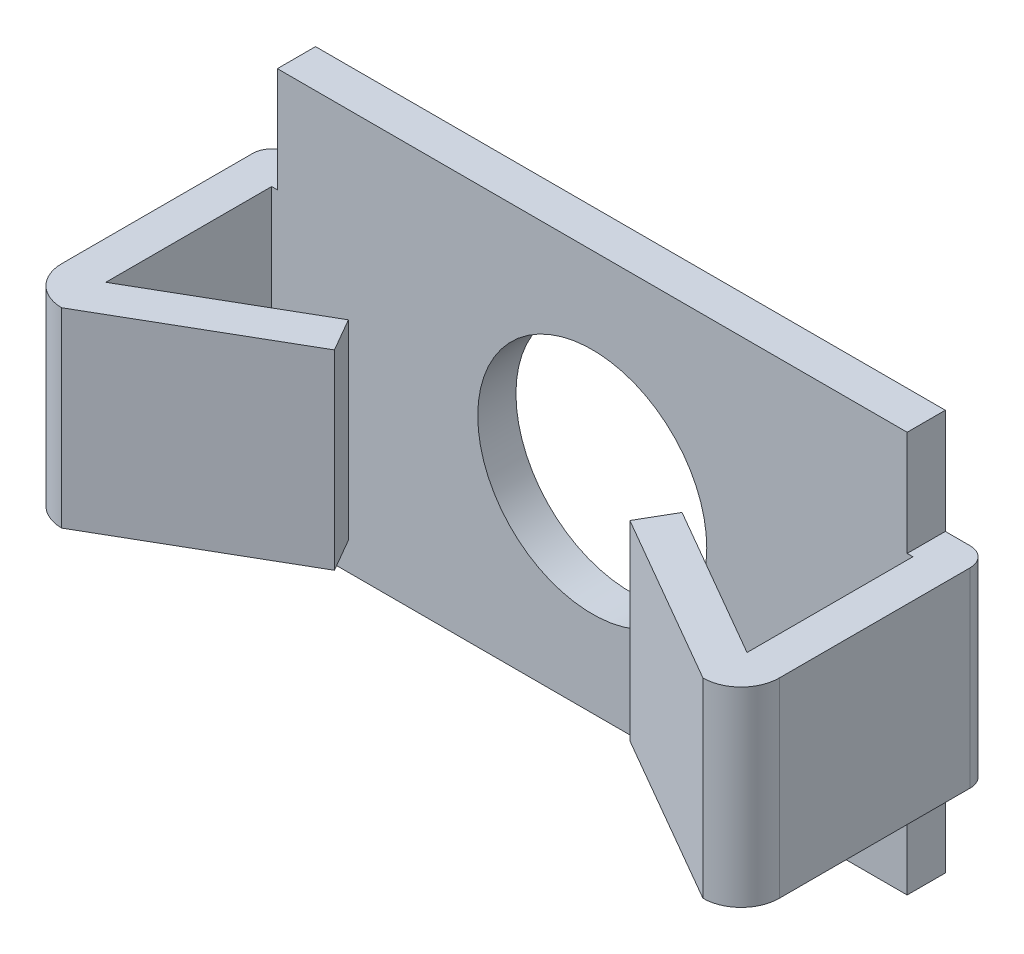
ISO-10303-21;
HEADER;
FILE_DESCRIPTION(('STEP AP214'),'2;1');
FILE_NAME('part.step','',(''),(''),'','','');
FILE_SCHEMA(('AUTOMOTIVE_DESIGN { 1 0 10303 214 1 1 1 1 }'));
ENDSEC;
DATA;
#1=APPLICATION_CONTEXT('core data for automotive mechanical design processes');
#2=APPLICATION_PROTOCOL_DEFINITION('international standard','automotive_design',2000,#1);
#3=PRODUCT_CONTEXT('',#1,'mechanical');
#4=PRODUCT('Part','Part','',(#3));
#5=PRODUCT_RELATED_PRODUCT_CATEGORY('part','',(#4));
#6=PRODUCT_DEFINITION_FORMATION('','',#4);
#7=PRODUCT_DEFINITION_CONTEXT('part definition',#1,'design');
#8=PRODUCT_DEFINITION('design','',#6,#7);
#9=PRODUCT_DEFINITION_SHAPE('','',#8);
#10=(LENGTH_UNIT() NAMED_UNIT(*) SI_UNIT(.MILLI.,.METRE.));
#11=(NAMED_UNIT(*) PLANE_ANGLE_UNIT() SI_UNIT($,.RADIAN.));
#12=(NAMED_UNIT(*) SI_UNIT($,.STERADIAN.) SOLID_ANGLE_UNIT());
#13=UNCERTAINTY_MEASURE_WITH_UNIT(LENGTH_MEASURE(1.E-05),#10,'distance_accuracy_value','');
#14=(GEOMETRIC_REPRESENTATION_CONTEXT(3) GLOBAL_UNCERTAINTY_ASSIGNED_CONTEXT((#13)) GLOBAL_UNIT_ASSIGNED_CONTEXT((#10,
#11,#12)) REPRESENTATION_CONTEXT('',''));
#15=CARTESIAN_POINT('',(0.,0.,0.));
#16=DIRECTION('',(0.,0.,1.));
#17=DIRECTION('',(1.,0.,0.));
#18=AXIS2_PLACEMENT_3D('',#15,#16,#17);
#19=CARTESIAN_POINT('',(16.8,5.,0.));
#20=DIRECTION('',(-1.,0.,0.));
#21=DIRECTION('',(0.,0.,-1.));
#22=AXIS2_PLACEMENT_3D('',#19,#20,#21);
#23=PLANE('',#22);
#24=DIRECTION('',(0.,0.,1.));
#25=VECTOR('',#24,1.);
#26=CARTESIAN_POINT('',(16.8,-5.,13.));
#27=LINE('',#26,#25);
#28=CARTESIAN_POINT('',(16.8,-5.,2.));
#29=VERTEX_POINT('',#28);
#30=CARTESIAN_POINT('',(16.8,-5.,10.6905989232415));
#31=VERTEX_POINT('',#30);
#32=EDGE_CURVE('E233',#29,#31,#27,.T.);
#33=ORIENTED_EDGE('',*,*,#32,.T.);
#34=DIRECTION('',(0.,1.,0.));
#35=VECTOR('',#34,1.);
#36=CARTESIAN_POINT('',(16.8,-16.4260197932816,10.6905989232415));
#37=LINE('',#36,#35);
#38=CARTESIAN_POINT('',(16.8,5.,10.6905989232415));
#39=VERTEX_POINT('',#38);
#40=EDGE_CURVE('E203',#31,#39,#37,.T.);
#41=ORIENTED_EDGE('',*,*,#40,.T.);
#42=DIRECTION('',(0.,0.,-1.));
#43=VECTOR('',#42,1.);
#44=CARTESIAN_POINT('',(16.8,5.,0.));
#45=LINE('',#44,#43);
#46=CARTESIAN_POINT('',(16.8,5.,2.));
#47=VERTEX_POINT('',#46);
#48=EDGE_CURVE('E218',#39,#47,#45,.T.);
#49=ORIENTED_EDGE('',*,*,#48,.T.);
#50=DIRECTION('',(0.,1.,0.));
#51=VECTOR('',#50,1.);
#52=CARTESIAN_POINT('',(16.8,10.5,2.));
#53=LINE('',#52,#51);
#54=EDGE_CURVE('E235',#29,#47,#53,.T.);
#55=ORIENTED_EDGE('',*,*,#54,.F.);
#56=EDGE_LOOP('',(#33,#41,#49,#55));
#57=FACE_BOUND('',#56,.T.);
#58=ADVANCED_FACE('F31',(#57),#23,.T.);
#59=CARTESIAN_POINT('',(18.8,-10.5,2.));
#60=DIRECTION('',(-1.,0.,0.));
#61=DIRECTION('',(0.,0.,1.));
#62=AXIS2_PLACEMENT_3D('',#59,#60,#61);
#63=PLANE('',#62);
#64=DIRECTION('',(0.,0.,1.));
#65=VECTOR('',#64,1.);
#66=CARTESIAN_POINT('',(18.8,-5.,0.));
#67=LINE('',#66,#65);
#68=CARTESIAN_POINT('',(18.8,-5.,1.));
#69=VERTEX_POINT('',#68);
#70=CARTESIAN_POINT('',(18.8,-5.,11.));
#71=VERTEX_POINT('',#70);
#72=EDGE_CURVE('E282',#69,#71,#67,.T.);
#73=ORIENTED_EDGE('',*,*,#72,.F.);
#74=DIRECTION('',(0.,1.,0.));
#75=VECTOR('',#74,1.);
#76=CARTESIAN_POINT('',(18.8,5.,1.));
#77=LINE('',#76,#75);
#78=CARTESIAN_POINT('',(18.8,5.,1.));
#79=VERTEX_POINT('',#78);
#80=EDGE_CURVE('E371',#69,#79,#77,.T.);
#81=ORIENTED_EDGE('',*,*,#80,.T.);
#82=DIRECTION('',(0.,0.,1.));
#83=VECTOR('',#82,1.);
#84=CARTESIAN_POINT('',(18.8,5.,0.));
#85=LINE('',#84,#83);
#86=CARTESIAN_POINT('',(18.8,5.,11.));
#87=VERTEX_POINT('',#86);
#88=EDGE_CURVE('E304',#79,#87,#85,.T.);
#89=ORIENTED_EDGE('',*,*,#88,.T.);
#90=DIRECTION('',(0.,1.,0.));
#91=VECTOR('',#90,1.);
#92=CARTESIAN_POINT('',(18.8,-10.5,11.));
#93=LINE('',#92,#91);
#94=EDGE_CURVE('E358',#87,#71,#93,.F.);
#95=ORIENTED_EDGE('',*,*,#94,.T.);
#96=EDGE_LOOP('',(#73,#81,#89,#95));
#97=FACE_BOUND('',#96,.T.);
#98=ADVANCED_FACE('F452',(#97),#63,.F.);
#99=CARTESIAN_POINT('',(-18.8,10.5,2.));
#100=DIRECTION('',(0.,-1.,0.));
#101=DIRECTION('',(0.,0.,-1.));
#102=AXIS2_PLACEMENT_3D('',#99,#100,#101);
#103=PLANE('',#102);
#104=DIRECTION('',(-1.,0.,0.));
#105=VECTOR('',#104,1.);
#106=CARTESIAN_POINT('',(-18.8,10.5,2.));
#107=LINE('',#106,#105);
#108=CARTESIAN_POINT('',(16.5,10.5,2.));
#109=VERTEX_POINT('',#108);
#110=CARTESIAN_POINT('',(-16.5,10.5,2.));
#111=VERTEX_POINT('',#110);
#112=EDGE_CURVE('E346',#109,#111,#107,.T.);
#113=ORIENTED_EDGE('',*,*,#112,.F.);
#114=DIRECTION('',(0.,0.,1.));
#115=VECTOR('',#114,1.);
#116=CARTESIAN_POINT('',(16.5,10.5,0.));
#117=LINE('',#116,#115);
#118=CARTESIAN_POINT('',(16.5,10.5,0.));
#119=VERTEX_POINT('',#118);
#120=EDGE_CURVE('E300',#119,#109,#117,.T.);
#121=ORIENTED_EDGE('',*,*,#120,.F.);
#122=DIRECTION('',(-1.,0.,0.));
#123=VECTOR('',#122,1.);
#124=CARTESIAN_POINT('',(-18.8,10.5,0.));
#125=LINE('',#124,#123);
#126=CARTESIAN_POINT('',(-16.5,10.5,0.));
#127=VERTEX_POINT('',#126);
#128=EDGE_CURVE('E341',#119,#127,#125,.T.);
#129=ORIENTED_EDGE('',*,*,#128,.T.);
#130=DIRECTION('',(0.,0.,1.));
#131=VECTOR('',#130,1.);
#132=CARTESIAN_POINT('',(-16.5,10.5,0.));
#133=LINE('',#132,#131);
#134=EDGE_CURVE('E338',#127,#111,#133,.T.);
#135=ORIENTED_EDGE('',*,*,#134,.T.);
#136=EDGE_LOOP('',(#113,#121,#129,#135));
#137=FACE_BOUND('',#136,.T.);
#138=ADVANCED_FACE('F434',(#137),#103,.F.);
#139=CARTESIAN_POINT('',(-18.8,-10.5,2.));
#140=DIRECTION('',(1.,0.,0.));
#141=DIRECTION('',(0.,0.,-1.));
#142=AXIS2_PLACEMENT_3D('',#139,#140,#141);
#143=PLANE('',#142);
#144=DIRECTION('',(0.,0.,1.));
#145=VECTOR('',#144,1.);
#146=CARTESIAN_POINT('',(-18.8,5.,0.));
#147=LINE('',#146,#145);
#148=CARTESIAN_POINT('',(-18.8,5.,1.));
#149=VERTEX_POINT('',#148);
#150=CARTESIAN_POINT('',(-18.8,5.,11.));
#151=VERTEX_POINT('',#150);
#152=EDGE_CURVE('E334',#149,#151,#147,.T.);
#153=ORIENTED_EDGE('',*,*,#152,.F.);
#154=DIRECTION('',(0.,-1.,0.));
#155=VECTOR('',#154,1.);
#156=CARTESIAN_POINT('',(-18.8,-5.,1.));
#157=LINE('',#156,#155);
#158=CARTESIAN_POINT('',(-18.8,-5.,1.));
#159=VERTEX_POINT('',#158);
#160=EDGE_CURVE('E382',#149,#159,#157,.T.);
#161=ORIENTED_EDGE('',*,*,#160,.T.);
#162=DIRECTION('',(0.,0.,1.));
#163=VECTOR('',#162,1.);
#164=CARTESIAN_POINT('',(-18.8,-5.,0.));
#165=LINE('',#164,#163);
#166=CARTESIAN_POINT('',(-18.8,-5.,11.));
#167=VERTEX_POINT('',#166);
#168=EDGE_CURVE('E322',#159,#167,#165,.T.);
#169=ORIENTED_EDGE('',*,*,#168,.T.);
#170=DIRECTION('',(0.,1.,0.));
#171=VECTOR('',#170,1.);
#172=CARTESIAN_POINT('',(-18.8,5.,11.));
#173=LINE('',#172,#171);
#174=EDGE_CURVE('E363',#167,#151,#173,.T.);
#175=ORIENTED_EDGE('',*,*,#174,.T.);
#176=EDGE_LOOP('',(#153,#161,#169,#175));
#177=FACE_BOUND('',#176,.T.);
#178=ADVANCED_FACE('F392',(#177),#143,.F.);
#179=CARTESIAN_POINT('',(-18.8,-10.5,2.));
#180=DIRECTION('',(0.,1.,0.));
#181=DIRECTION('',(0.,0.,1.));
#182=AXIS2_PLACEMENT_3D('',#179,#180,#181);
#183=PLANE('',#182);
#184=DIRECTION('',(1.,0.,0.));
#185=VECTOR('',#184,1.);
#186=CARTESIAN_POINT('',(-18.8,-10.5,0.));
#187=LINE('',#186,#185);
#188=CARTESIAN_POINT('',(-16.5,-10.5,0.));
#189=VERTEX_POINT('',#188);
#190=CARTESIAN_POINT('',(16.5,-10.5,0.));
#191=VERTEX_POINT('',#190);
#192=EDGE_CURVE('E349',#189,#191,#187,.T.);
#193=ORIENTED_EDGE('',*,*,#192,.T.);
#194=DIRECTION('',(0.,0.,1.));
#195=VECTOR('',#194,1.);
#196=CARTESIAN_POINT('',(16.5,-10.5,0.));
#197=LINE('',#196,#195);
#198=CARTESIAN_POINT('',(16.5,-10.5,2.));
#199=VERTEX_POINT('',#198);
#200=EDGE_CURVE('E285',#191,#199,#197,.T.);
#201=ORIENTED_EDGE('',*,*,#200,.T.);
#202=DIRECTION('',(1.,0.,0.));
#203=VECTOR('',#202,1.);
#204=CARTESIAN_POINT('',(-18.8,-10.5,2.));
#205=LINE('',#204,#203);
#206=CARTESIAN_POINT('',(-16.5,-10.5,2.));
#207=VERTEX_POINT('',#206);
#208=EDGE_CURVE('E348',#207,#199,#205,.T.);
#209=ORIENTED_EDGE('',*,*,#208,.F.);
#210=DIRECTION('',(0.,0.,1.));
#211=VECTOR('',#210,1.);
#212=CARTESIAN_POINT('',(-16.5,-10.5,0.));
#213=LINE('',#212,#211);
#214=EDGE_CURVE('E317',#189,#207,#213,.T.);
#215=ORIENTED_EDGE('',*,*,#214,.F.);
#216=EDGE_LOOP('',(#193,#201,#209,#215));
#217=FACE_BOUND('',#216,.T.);
#218=ADVANCED_FACE('F507',(#217),#183,.F.);
#219=CARTESIAN_POINT('',(18.8,10.5,2.));
#220=DIRECTION('',(0.,0.,-1.));
#221=DIRECTION('',(-1.,0.,0.));
#222=AXIS2_PLACEMENT_3D('',#219,#220,#221);
#223=PLANE('',#222);
#224=CARTESIAN_POINT('',(0.,0.,2.));
#225=DIRECTION('',(0.,0.,-1.));
#226=DIRECTION('',(-1.,0.,0.));
#227=AXIS2_PLACEMENT_3D('',#224,#225,#226);
#228=CIRCLE('',#227,6.);
#229=CARTESIAN_POINT('',(-6.,0.,2.));
#230=VERTEX_POINT('',#229);
#231=EDGE_CURVE('E241',#230,#230,#228,.T.);
#232=ORIENTED_EDGE('',*,*,#231,.T.);
#233=EDGE_LOOP('',(#232));
#234=FACE_BOUND('',#233,.T.);
#235=DIRECTION('',(-1.,0.,0.));
#236=VECTOR('',#235,1.);
#237=CARTESIAN_POINT('',(16.5,-5.,2.));
#238=LINE('',#237,#236);
#239=CARTESIAN_POINT('',(16.5,-5.,2.));
#240=VERTEX_POINT('',#239);
#241=EDGE_CURVE('E275',#29,#240,#238,.T.);
#242=ORIENTED_EDGE('',*,*,#241,.F.);
#243=ORIENTED_EDGE('',*,*,#54,.T.);
#244=DIRECTION('',(1.,0.,0.));
#245=VECTOR('',#244,1.);
#246=CARTESIAN_POINT('',(16.5,5.,2.));
#247=LINE('',#246,#245);
#248=CARTESIAN_POINT('',(16.5,5.,2.));
#249=VERTEX_POINT('',#248);
#250=EDGE_CURVE('E297',#249,#47,#247,.T.);
#251=ORIENTED_EDGE('',*,*,#250,.F.);
#252=DIRECTION('',(0.,-1.,0.));
#253=VECTOR('',#252,1.);
#254=CARTESIAN_POINT('',(16.5,10.5,2.));
#255=LINE('',#254,#253);
#256=EDGE_CURVE('E288',#109,#249,#255,.T.);
#257=ORIENTED_EDGE('',*,*,#256,.F.);
#258=ORIENTED_EDGE('',*,*,#112,.T.);
#259=DIRECTION('',(0.,1.,0.));
#260=VECTOR('',#259,1.);
#261=CARTESIAN_POINT('',(-16.5,10.5,2.));
#262=LINE('',#261,#260);
#263=CARTESIAN_POINT('',(-16.5,5.,2.));
#264=VERTEX_POINT('',#263);
#265=EDGE_CURVE('E331',#264,#111,#262,.T.);
#266=ORIENTED_EDGE('',*,*,#265,.F.);
#267=DIRECTION('',(1.,0.,0.));
#268=VECTOR('',#267,1.);
#269=CARTESIAN_POINT('',(-16.5,5.,2.));
#270=LINE('',#269,#268);
#271=CARTESIAN_POINT('',(-16.8,5.,2.));
#272=VERTEX_POINT('',#271);
#273=EDGE_CURVE('E324',#272,#264,#270,.T.);
#274=ORIENTED_EDGE('',*,*,#273,.F.);
#275=DIRECTION('',(0.,-1.,0.));
#276=VECTOR('',#275,1.);
#277=CARTESIAN_POINT('',(-16.8,10.5,2.));
#278=LINE('',#277,#276);
#279=CARTESIAN_POINT('',(-16.8,-5.,2.));
#280=VERTEX_POINT('',#279);
#281=EDGE_CURVE('E273',#272,#280,#278,.T.);
#282=ORIENTED_EDGE('',*,*,#281,.T.);
#283=DIRECTION('',(-1.,0.,0.));
#284=VECTOR('',#283,1.);
#285=CARTESIAN_POINT('',(-16.5,-5.,2.));
#286=LINE('',#285,#284);
#287=CARTESIAN_POINT('',(-16.5,-5.,2.));
#288=VERTEX_POINT('',#287);
#289=EDGE_CURVE('E314',#288,#280,#286,.T.);
#290=ORIENTED_EDGE('',*,*,#289,.F.);
#291=DIRECTION('',(0.,1.,0.));
#292=VECTOR('',#291,1.);
#293=CARTESIAN_POINT('',(-16.5,-5.,2.));
#294=LINE('',#293,#292);
#295=EDGE_CURVE('E306',#207,#288,#294,.T.);
#296=ORIENTED_EDGE('',*,*,#295,.F.);
#297=ORIENTED_EDGE('',*,*,#208,.T.);
#298=DIRECTION('',(0.,-1.,0.));
#299=VECTOR('',#298,1.);
#300=CARTESIAN_POINT('',(16.5,-5.,2.));
#301=LINE('',#300,#299);
#302=EDGE_CURVE('E279',#240,#199,#301,.T.);
#303=ORIENTED_EDGE('',*,*,#302,.F.);
#304=EDGE_LOOP('',(#242,#243,#251,#257,#258,#266,#274,#282,#290,#296,#297,#303));
#305=FACE_BOUND('',#304,.T.);
#306=ADVANCED_FACE('F421',(#234,#305),#223,.F.);
#307=CARTESIAN_POINT('',(18.8,10.5,0.));
#308=DIRECTION('',(0.,0.,-1.));
#309=DIRECTION('',(-1.,0.,0.));
#310=AXIS2_PLACEMENT_3D('',#307,#308,#309);
#311=PLANE('',#310);
#312=DIRECTION('',(1.,0.,0.));
#313=VECTOR('',#312,1.);
#314=CARTESIAN_POINT('',(16.5,5.,0.));
#315=LINE('',#314,#313);
#316=CARTESIAN_POINT('',(16.5,5.,0.));
#317=VERTEX_POINT('',#316);
#318=CARTESIAN_POINT('',(17.8,5.,0.));
#319=VERTEX_POINT('',#318);
#320=EDGE_CURVE('E296',#317,#319,#315,.T.);
#321=ORIENTED_EDGE('',*,*,#320,.T.);
#322=DIRECTION('',(0.,1.,0.));
#323=VECTOR('',#322,1.);
#324=CARTESIAN_POINT('',(17.8,-5.,0.));
#325=LINE('',#324,#323);
#326=CARTESIAN_POINT('',(17.8,-5.,0.));
#327=VERTEX_POINT('',#326);
#328=EDGE_CURVE('E378',#319,#327,#325,.F.);
#329=ORIENTED_EDGE('',*,*,#328,.T.);
#330=DIRECTION('',(-1.,0.,0.));
#331=VECTOR('',#330,1.);
#332=CARTESIAN_POINT('',(16.5,-5.,0.));
#333=LINE('',#332,#331);
#334=CARTESIAN_POINT('',(16.5,-5.,0.));
#335=VERTEX_POINT('',#334);
#336=EDGE_CURVE('E276',#327,#335,#333,.T.);
#337=ORIENTED_EDGE('',*,*,#336,.T.);
#338=DIRECTION('',(0.,-1.,0.));
#339=VECTOR('',#338,1.);
#340=CARTESIAN_POINT('',(16.5,-5.,0.));
#341=LINE('',#340,#339);
#342=EDGE_CURVE('E278',#335,#191,#341,.T.);
#343=ORIENTED_EDGE('',*,*,#342,.T.);
#344=ORIENTED_EDGE('',*,*,#192,.F.);
#345=DIRECTION('',(0.,1.,0.));
#346=VECTOR('',#345,1.);
#347=CARTESIAN_POINT('',(-16.5,-5.,0.));
#348=LINE('',#347,#346);
#349=CARTESIAN_POINT('',(-16.5,-5.,0.));
#350=VERTEX_POINT('',#349);
#351=EDGE_CURVE('E310',#189,#350,#348,.T.);
#352=ORIENTED_EDGE('',*,*,#351,.T.);
#353=DIRECTION('',(-1.,0.,0.));
#354=VECTOR('',#353,1.);
#355=CARTESIAN_POINT('',(-16.5,-5.,0.));
#356=LINE('',#355,#354);
#357=CARTESIAN_POINT('',(-17.8,-5.,0.));
#358=VERTEX_POINT('',#357);
#359=EDGE_CURVE('E313',#350,#358,#356,.T.);
#360=ORIENTED_EDGE('',*,*,#359,.T.);
#361=DIRECTION('',(0.,-1.,0.));
#362=VECTOR('',#361,1.);
#363=CARTESIAN_POINT('',(-17.8,5.,0.));
#364=LINE('',#363,#362);
#365=CARTESIAN_POINT('',(-17.8,5.,0.));
#366=VERTEX_POINT('',#365);
#367=EDGE_CURVE('E376',#358,#366,#364,.F.);
#368=ORIENTED_EDGE('',*,*,#367,.T.);
#369=DIRECTION('',(1.,0.,0.));
#370=VECTOR('',#369,1.);
#371=CARTESIAN_POINT('',(-16.5,5.,0.));
#372=LINE('',#371,#370);
#373=CARTESIAN_POINT('',(-16.5,5.,0.));
#374=VERTEX_POINT('',#373);
#375=EDGE_CURVE('E328',#366,#374,#372,.T.);
#376=ORIENTED_EDGE('',*,*,#375,.T.);
#377=DIRECTION('',(0.,1.,0.));
#378=VECTOR('',#377,1.);
#379=CARTESIAN_POINT('',(-16.5,10.5,0.));
#380=LINE('',#379,#378);
#381=EDGE_CURVE('E330',#374,#127,#380,.T.);
#382=ORIENTED_EDGE('',*,*,#381,.T.);
#383=ORIENTED_EDGE('',*,*,#128,.F.);
#384=DIRECTION('',(0.,-1.,0.));
#385=VECTOR('',#384,1.);
#386=CARTESIAN_POINT('',(16.5,10.5,0.));
#387=LINE('',#386,#385);
#388=EDGE_CURVE('E293',#119,#317,#387,.T.);
#389=ORIENTED_EDGE('',*,*,#388,.T.);
#390=EDGE_LOOP('',(#321,#329,#337,#343,#344,#352,#360,#368,#376,#382,#383,#389));
#391=FACE_BOUND('',#390,.T.);
#392=CARTESIAN_POINT('',(0.,0.,0.));
#393=DIRECTION('',(0.,0.,-1.));
#394=DIRECTION('',(-1.,0.,0.));
#395=AXIS2_PLACEMENT_3D('',#392,#393,#394);
#396=CIRCLE('',#395,6.);
#397=CARTESIAN_POINT('',(-6.,0.,0.));
#398=VERTEX_POINT('',#397);
#399=EDGE_CURVE('E238',#398,#398,#396,.T.);
#400=ORIENTED_EDGE('',*,*,#399,.F.);
#401=EDGE_LOOP('',(#400));
#402=FACE_BOUND('',#401,.T.);
#403=ADVANCED_FACE('F388',(#391,#402),#311,.T.);
#404=CARTESIAN_POINT('',(-16.5,10.5,0.));
#405=DIRECTION('',(1.,0.,0.));
#406=DIRECTION('',(0.,1.,0.));
#407=AXIS2_PLACEMENT_3D('',#404,#405,#406);
#408=PLANE('',#407);
#409=ORIENTED_EDGE('',*,*,#265,.T.);
#410=ORIENTED_EDGE('',*,*,#134,.F.);
#411=ORIENTED_EDGE('',*,*,#381,.F.);
#412=DIRECTION('',(0.,0.,1.));
#413=VECTOR('',#412,1.);
#414=CARTESIAN_POINT('',(-16.5,5.,0.));
#415=LINE('',#414,#413);
#416=EDGE_CURVE('E342',#374,#264,#415,.T.);
#417=ORIENTED_EDGE('',*,*,#416,.T.);
#418=EDGE_LOOP('',(#409,#410,#411,#417));
#419=FACE_BOUND('',#418,.T.);
#420=ADVANCED_FACE('F428',(#419),#408,.F.);
#421=CARTESIAN_POINT('',(-16.5,5.,0.));
#422=DIRECTION('',(0.,-1.,0.));
#423=DIRECTION('',(1.,0.,0.));
#424=AXIS2_PLACEMENT_3D('',#421,#422,#423);
#425=PLANE('',#424);
#426=ORIENTED_EDGE('',*,*,#375,.F.);
#427=CARTESIAN_POINT('',(-17.8,5.,1.));
#428=DIRECTION('',(0.,-1.,0.));
#429=DIRECTION('',(1.,0.,0.));
#430=AXIS2_PLACEMENT_3D('',#427,#428,#429);
#431=CIRCLE('',#430,1.);
#432=EDGE_CURVE('E11',#366,#149,#431,.F.);
#433=ORIENTED_EDGE('',*,*,#432,.T.);
#434=ORIENTED_EDGE('',*,*,#152,.T.);
#435=CARTESIAN_POINT('',(-16.8,5.,11.));
#436=DIRECTION('',(0.,-1.,0.));
#437=DIRECTION('',(1.,0.,0.));
#438=AXIS2_PLACEMENT_3D('',#435,#436,#437);
#439=CIRCLE('',#438,2.);
#440=CARTESIAN_POINT('',(-16.8,5.,13.));
#441=VERTEX_POINT('',#440);
#442=EDGE_CURVE('E366',#151,#441,#439,.F.);
#443=ORIENTED_EDGE('',*,*,#442,.T.);
#444=DIRECTION('',(0.866025403784436,0.,-0.500000000000004));
#445=VECTOR('',#444,1.);
#446=CARTESIAN_POINT('',(-7.74041559303621,5.00000000000001,7.76944650389326));
#447=LINE('',#446,#445);
#448=CARTESIAN_POINT('',(-7.74041559303621,5.00000000000001,7.76944650389326));
#449=VERTEX_POINT('',#448);
#450=EDGE_CURVE('E244',#441,#449,#447,.T.);
#451=ORIENTED_EDGE('',*,*,#450,.T.);
#452=DIRECTION('',(-0.500000000000005,0.,-0.866025403784436));
#453=VECTOR('',#452,1.);
#454=CARTESIAN_POINT('',(-8.74041559303622,5.00000000000001,6.03739569632439));
#455=LINE('',#454,#453);
#456=CARTESIAN_POINT('',(-8.74041559303622,5.00000000000001,6.03739569632439));
#457=VERTEX_POINT('',#456);
#458=EDGE_CURVE('E253',#449,#457,#455,.T.);
#459=ORIENTED_EDGE('',*,*,#458,.T.);
#460=DIRECTION('',(-0.866025403784436,0.,0.500000000000004));
#461=VECTOR('',#460,1.);
#462=CARTESIAN_POINT('',(-8.74041559303622,5.00000000000001,6.03739569632439));
#463=LINE('',#462,#461);
#464=CARTESIAN_POINT('',(-16.8,5.00000000000001,10.6905989232415));
#465=VERTEX_POINT('',#464);
#466=EDGE_CURVE('E256',#457,#465,#463,.T.);
#467=ORIENTED_EDGE('',*,*,#466,.T.);
#468=DIRECTION('',(0.,0.,-1.));
#469=VECTOR('',#468,1.);
#470=CARTESIAN_POINT('',(-16.8,5.,0.));
#471=LINE('',#470,#469);
#472=EDGE_CURVE('E271',#465,#272,#471,.T.);
#473=ORIENTED_EDGE('',*,*,#472,.T.);
#474=ORIENTED_EDGE('',*,*,#273,.T.);
#475=ORIENTED_EDGE('',*,*,#416,.F.);
#476=EDGE_LOOP('',(#426,#433,#434,#443,#451,#459,#467,#473,#474,#475));
#477=FACE_BOUND('',#476,.T.);
#478=ADVANCED_FACE('F395',(#477),#425,.F.);
#479=CARTESIAN_POINT('',(-16.5,-5.,0.));
#480=DIRECTION('',(0.,1.,0.));
#481=DIRECTION('',(-1.,0.,0.));
#482=AXIS2_PLACEMENT_3D('',#479,#480,#481);
#483=PLANE('',#482);
#484=ORIENTED_EDGE('',*,*,#168,.F.);
#485=CARTESIAN_POINT('',(-17.8,-5.,1.));
#486=DIRECTION('',(0.,1.,0.));
#487=DIRECTION('',(-1.,0.,0.));
#488=AXIS2_PLACEMENT_3D('',#485,#486,#487);
#489=CIRCLE('',#488,1.);
#490=EDGE_CURVE('E39',#159,#358,#489,.F.);
#491=ORIENTED_EDGE('',*,*,#490,.T.);
#492=ORIENTED_EDGE('',*,*,#359,.F.);
#493=DIRECTION('',(0.,0.,1.));
#494=VECTOR('',#493,1.);
#495=CARTESIAN_POINT('',(-16.5,-5.,0.));
#496=LINE('',#495,#494);
#497=EDGE_CURVE('E325',#350,#288,#496,.T.);
#498=ORIENTED_EDGE('',*,*,#497,.T.);
#499=ORIENTED_EDGE('',*,*,#289,.T.);
#500=DIRECTION('',(0.,0.,1.));
#501=VECTOR('',#500,1.);
#502=CARTESIAN_POINT('',(-16.8,-5.,13.));
#503=LINE('',#502,#501);
#504=CARTESIAN_POINT('',(-16.8,-5.,10.6905989232415));
#505=VERTEX_POINT('',#504);
#506=EDGE_CURVE('E265',#280,#505,#503,.T.);
#507=ORIENTED_EDGE('',*,*,#506,.T.);
#508=DIRECTION('',(0.866025403784436,0.,-0.500000000000004));
#509=VECTOR('',#508,1.);
#510=CARTESIAN_POINT('',(-8.74041559303622,-5.,6.03739569632439));
#511=LINE('',#510,#509);
#512=CARTESIAN_POINT('',(-8.74041559303622,-5.,6.03739569632439));
#513=VERTEX_POINT('',#512);
#514=EDGE_CURVE('E247',#505,#513,#511,.T.);
#515=ORIENTED_EDGE('',*,*,#514,.T.);
#516=DIRECTION('',(0.500000000000005,0.,0.866025403784436));
#517=VECTOR('',#516,1.);
#518=CARTESIAN_POINT('',(-8.74041559303622,-5.,6.03739569632439));
#519=LINE('',#518,#517);
#520=CARTESIAN_POINT('',(-7.74041559303621,-5.,7.76944650389326));
#521=VERTEX_POINT('',#520);
#522=EDGE_CURVE('E245',#513,#521,#519,.T.);
#523=ORIENTED_EDGE('',*,*,#522,.T.);
#524=DIRECTION('',(-0.866025403784436,0.,0.500000000000004));
#525=VECTOR('',#524,1.);
#526=CARTESIAN_POINT('',(-7.74041559303621,-5.,7.76944650389326));
#527=LINE('',#526,#525);
#528=CARTESIAN_POINT('',(-16.8,-5.,13.));
#529=VERTEX_POINT('',#528);
#530=EDGE_CURVE('E250',#521,#529,#527,.T.);
#531=ORIENTED_EDGE('',*,*,#530,.T.);
#532=CARTESIAN_POINT('',(-16.8,-5.,11.));
#533=DIRECTION('',(0.,1.,0.));
#534=DIRECTION('',(-1.,0.,0.));
#535=AXIS2_PLACEMENT_3D('',#532,#533,#534);
#536=CIRCLE('',#535,2.);
#537=EDGE_CURVE('E368',#529,#167,#536,.F.);
#538=ORIENTED_EDGE('',*,*,#537,.T.);
#539=EDGE_LOOP('',(#484,#491,#492,#498,#499,#507,#515,#523,#531,#538));
#540=FACE_BOUND('',#539,.T.);
#541=ADVANCED_FACE('F385',(#540),#483,.F.);
#542=CARTESIAN_POINT('',(-16.5,-5.,0.));
#543=DIRECTION('',(1.,0.,0.));
#544=DIRECTION('',(0.,0.,-1.));
#545=AXIS2_PLACEMENT_3D('',#542,#543,#544);
#546=PLANE('',#545);
#547=ORIENTED_EDGE('',*,*,#295,.T.);
#548=ORIENTED_EDGE('',*,*,#497,.F.);
#549=ORIENTED_EDGE('',*,*,#351,.F.);
#550=ORIENTED_EDGE('',*,*,#214,.T.);
#551=EDGE_LOOP('',(#547,#548,#549,#550));
#552=FACE_BOUND('',#551,.T.);
#553=ADVANCED_FACE('F493',(#552),#546,.F.);
#554=CARTESIAN_POINT('',(16.5,5.,0.));
#555=DIRECTION('',(0.,-1.,0.));
#556=DIRECTION('',(1.,0.,0.));
#557=AXIS2_PLACEMENT_3D('',#554,#555,#556);
#558=PLANE('',#557);
#559=ORIENTED_EDGE('',*,*,#88,.F.);
#560=CARTESIAN_POINT('',(17.8,5.,1.));
#561=DIRECTION('',(0.,-1.,0.));
#562=DIRECTION('',(1.,0.,0.));
#563=AXIS2_PLACEMENT_3D('',#560,#561,#562);
#564=CIRCLE('',#563,1.);
#565=EDGE_CURVE('E374',#79,#319,#564,.F.);
#566=ORIENTED_EDGE('',*,*,#565,.T.);
#567=ORIENTED_EDGE('',*,*,#320,.F.);
#568=DIRECTION('',(0.,0.,1.));
#569=VECTOR('',#568,1.);
#570=CARTESIAN_POINT('',(16.5,5.,0.));
#571=LINE('',#570,#569);
#572=EDGE_CURVE('E307',#317,#249,#571,.T.);
#573=ORIENTED_EDGE('',*,*,#572,.T.);
#574=ORIENTED_EDGE('',*,*,#250,.T.);
#575=ORIENTED_EDGE('',*,*,#48,.F.);
#576=DIRECTION('',(0.866025403784436,0.,0.500000000000004));
#577=VECTOR('',#576,1.);
#578=CARTESIAN_POINT('',(8.74041559303622,5.00000000000001,6.03739569632439));
#579=LINE('',#578,#577);
#580=CARTESIAN_POINT('',(8.74041559303622,5.00000000000001,6.03739569632439));
#581=VERTEX_POINT('',#580);
#582=EDGE_CURVE('E197',#581,#39,#579,.T.);
#583=ORIENTED_EDGE('',*,*,#582,.F.);
#584=DIRECTION('',(0.500000000000005,0.,-0.866025403784436));
#585=VECTOR('',#584,1.);
#586=CARTESIAN_POINT('',(8.74041559303622,5.00000000000001,6.03739569632439));
#587=LINE('',#586,#585);
#588=CARTESIAN_POINT('',(7.74041559303621,5.00000000000001,7.76944650389326));
#589=VERTEX_POINT('',#588);
#590=EDGE_CURVE('E206',#589,#581,#587,.T.);
#591=ORIENTED_EDGE('',*,*,#590,.F.);
#592=DIRECTION('',(-0.866025403784436,0.,-0.500000000000004));
#593=VECTOR('',#592,1.);
#594=CARTESIAN_POINT('',(7.74041559303621,5.00000000000001,7.76944650389326));
#595=LINE('',#594,#593);
#596=CARTESIAN_POINT('',(16.8,5.00000000000001,13.));
#597=VERTEX_POINT('',#596);
#598=EDGE_CURVE('E212',#597,#589,#595,.T.);
#599=ORIENTED_EDGE('',*,*,#598,.F.);
#600=CARTESIAN_POINT('',(16.8,5.,11.));
#601=DIRECTION('',(0.,-1.,0.));
#602=DIRECTION('',(1.,0.,0.));
#603=AXIS2_PLACEMENT_3D('',#600,#601,#602);
#604=CIRCLE('',#603,2.);
#605=EDGE_CURVE('E352',#597,#87,#604,.F.);
#606=ORIENTED_EDGE('',*,*,#605,.T.);
#607=EDGE_LOOP('',(#559,#566,#567,#573,#574,#575,#583,#591,#599,#606));
#608=FACE_BOUND('',#607,.T.);
#609=ADVANCED_FACE('F216',(#608),#558,.F.);
#610=CARTESIAN_POINT('',(16.5,10.5,0.));
#611=DIRECTION('',(-1.,0.,0.));
#612=DIRECTION('',(0.,0.,1.));
#613=AXIS2_PLACEMENT_3D('',#610,#611,#612);
#614=PLANE('',#613);
#615=ORIENTED_EDGE('',*,*,#256,.T.);
#616=ORIENTED_EDGE('',*,*,#572,.F.);
#617=ORIENTED_EDGE('',*,*,#388,.F.);
#618=ORIENTED_EDGE('',*,*,#120,.T.);
#619=EDGE_LOOP('',(#615,#616,#617,#618));
#620=FACE_BOUND('',#619,.T.);
#621=ADVANCED_FACE('F437',(#620),#614,.F.);
#622=CARTESIAN_POINT('',(16.5,-5.,0.));
#623=DIRECTION('',(-1.,0.,0.));
#624=DIRECTION('',(0.,-1.,0.));
#625=AXIS2_PLACEMENT_3D('',#622,#623,#624);
#626=PLANE('',#625);
#627=ORIENTED_EDGE('',*,*,#302,.T.);
#628=ORIENTED_EDGE('',*,*,#200,.F.);
#629=ORIENTED_EDGE('',*,*,#342,.F.);
#630=DIRECTION('',(0.,0.,1.));
#631=VECTOR('',#630,1.);
#632=CARTESIAN_POINT('',(16.5,-5.,0.));
#633=LINE('',#632,#631);
#634=EDGE_CURVE('E289',#335,#240,#633,.T.);
#635=ORIENTED_EDGE('',*,*,#634,.T.);
#636=EDGE_LOOP('',(#627,#628,#629,#635));
#637=FACE_BOUND('',#636,.T.);
#638=ADVANCED_FACE('F485',(#637),#626,.F.);
#639=CARTESIAN_POINT('',(16.5,-5.,0.));
#640=DIRECTION('',(0.,1.,0.));
#641=DIRECTION('',(0.,0.,1.));
#642=AXIS2_PLACEMENT_3D('',#639,#640,#641);
#643=PLANE('',#642);
#644=ORIENTED_EDGE('',*,*,#336,.F.);
#645=CARTESIAN_POINT('',(17.8,-5.,1.));
#646=DIRECTION('',(0.,1.,0.));
#647=DIRECTION('',(0.,0.,1.));
#648=AXIS2_PLACEMENT_3D('',#645,#646,#647);
#649=CIRCLE('',#648,1.);
#650=EDGE_CURVE('E380',#327,#69,#649,.F.);
#651=ORIENTED_EDGE('',*,*,#650,.T.);
#652=ORIENTED_EDGE('',*,*,#72,.T.);
#653=CARTESIAN_POINT('',(16.8,-5.,11.));
#654=DIRECTION('',(0.,1.,0.));
#655=DIRECTION('',(0.,0.,1.));
#656=AXIS2_PLACEMENT_3D('',#653,#654,#655);
#657=CIRCLE('',#656,2.);
#658=CARTESIAN_POINT('',(16.8,-5.,13.));
#659=VERTEX_POINT('',#658);
#660=EDGE_CURVE('E361',#71,#659,#657,.F.);
#661=ORIENTED_EDGE('',*,*,#660,.T.);
#662=DIRECTION('',(0.866025403784436,0.,0.500000000000004));
#663=VECTOR('',#662,1.);
#664=CARTESIAN_POINT('',(7.7404155930362,-4.99999999999999,7.76944650389326));
#665=LINE('',#664,#663);
#666=CARTESIAN_POINT('',(7.74041559303621,-4.99999999999999,7.76944650389326));
#667=VERTEX_POINT('',#666);
#668=EDGE_CURVE('E221',#667,#659,#665,.T.);
#669=ORIENTED_EDGE('',*,*,#668,.F.);
#670=DIRECTION('',(-0.500000000000005,0.,0.866025403784436));
#671=VECTOR('',#670,1.);
#672=CARTESIAN_POINT('',(8.74041559303621,-4.99999999999999,6.03739569632439));
#673=LINE('',#672,#671);
#674=CARTESIAN_POINT('',(8.74041559303622,-4.99999999999999,6.03739569632439));
#675=VERTEX_POINT('',#674);
#676=EDGE_CURVE('E228',#675,#667,#673,.T.);
#677=ORIENTED_EDGE('',*,*,#676,.F.);
#678=DIRECTION('',(-0.866025403784436,0.,-0.500000000000004));
#679=VECTOR('',#678,1.);
#680=CARTESIAN_POINT('',(8.74041559303621,-4.99999999999999,6.03739569632439));
#681=LINE('',#680,#679);
#682=EDGE_CURVE('E199',#31,#675,#681,.T.);
#683=ORIENTED_EDGE('',*,*,#682,.F.);
#684=ORIENTED_EDGE('',*,*,#32,.F.);
#685=ORIENTED_EDGE('',*,*,#241,.T.);
#686=ORIENTED_EDGE('',*,*,#634,.F.);
#687=EDGE_LOOP('',(#644,#651,#652,#661,#669,#677,#683,#684,#685,#686));
#688=FACE_BOUND('',#687,.T.);
#689=ADVANCED_FACE('F449',(#688),#643,.F.);
#690=CARTESIAN_POINT('',(-16.8,5.,0.));
#691=DIRECTION('',(1.,0.,0.));
#692=DIRECTION('',(0.,0.,-1.));
#693=AXIS2_PLACEMENT_3D('',#690,#691,#692);
#694=PLANE('',#693);
#695=DIRECTION('',(0.,1.,0.));
#696=VECTOR('',#695,1.);
#697=CARTESIAN_POINT('',(-16.8,-16.4260197932816,10.6905989232415));
#698=LINE('',#697,#696);
#699=EDGE_CURVE('E248',#505,#465,#698,.T.);
#700=ORIENTED_EDGE('',*,*,#699,.F.);
#701=ORIENTED_EDGE('',*,*,#506,.F.);
#702=ORIENTED_EDGE('',*,*,#281,.F.);
#703=ORIENTED_EDGE('',*,*,#472,.F.);
#704=EDGE_LOOP('',(#700,#701,#702,#703));
#705=FACE_BOUND('',#704,.T.);
#706=ADVANCED_FACE('F415',(#705),#694,.T.);
#707=CARTESIAN_POINT('',(-8.74041559303622,-16.4260197932816,6.03739569632439));
#708=DIRECTION('',(-0.500000000000004,0.,-0.866025403784436));
#709=DIRECTION('',(-0.866025403784436,0.,0.500000000000004));
#710=AXIS2_PLACEMENT_3D('',#707,#708,#709);
#711=PLANE('',#710);
#712=ORIENTED_EDGE('',*,*,#514,.F.);
#713=ORIENTED_EDGE('',*,*,#699,.T.);
#714=ORIENTED_EDGE('',*,*,#466,.F.);
#715=DIRECTION('',(0.,1.,0.));
#716=VECTOR('',#715,1.);
#717=CARTESIAN_POINT('',(-8.74041559303622,-16.4260197932816,6.03739569632439));
#718=LINE('',#717,#716);
#719=EDGE_CURVE('E261',#513,#457,#718,.T.);
#720=ORIENTED_EDGE('',*,*,#719,.F.);
#721=EDGE_LOOP('',(#712,#713,#714,#720));
#722=FACE_BOUND('',#721,.T.);
#723=ADVANCED_FACE('F411',(#722),#711,.T.);
#724=CARTESIAN_POINT('',(-8.74041559303622,-16.4260197932816,6.03739569632439));
#725=DIRECTION('',(0.866025403784436,0.,-0.500000000000005));
#726=DIRECTION('',(-0.500000000000005,0.,-0.866025403784436));
#727=AXIS2_PLACEMENT_3D('',#724,#725,#726);
#728=PLANE('',#727);
#729=ORIENTED_EDGE('',*,*,#522,.F.);
#730=ORIENTED_EDGE('',*,*,#719,.T.);
#731=ORIENTED_EDGE('',*,*,#458,.F.);
#732=DIRECTION('',(0.,1.,0.));
#733=VECTOR('',#732,1.);
#734=CARTESIAN_POINT('',(-7.74041559303621,-16.4260197932816,7.76944650389326));
#735=LINE('',#734,#733);
#736=EDGE_CURVE('E259',#521,#449,#735,.T.);
#737=ORIENTED_EDGE('',*,*,#736,.F.);
#738=EDGE_LOOP('',(#729,#730,#731,#737));
#739=FACE_BOUND('',#738,.T.);
#740=ADVANCED_FACE('F478',(#739),#728,.T.);
#741=CARTESIAN_POINT('',(-7.74041559303621,-16.4260197932816,7.76944650389326));
#742=DIRECTION('',(0.500000000000004,0.,0.866025403784436));
#743=DIRECTION('',(0.866025403784436,0.,-0.500000000000004));
#744=AXIS2_PLACEMENT_3D('',#741,#742,#743);
#745=PLANE('',#744);
#746=ORIENTED_EDGE('',*,*,#530,.F.);
#747=ORIENTED_EDGE('',*,*,#736,.T.);
#748=ORIENTED_EDGE('',*,*,#450,.F.);
#749=DIRECTION('',(0.,1.,0.));
#750=VECTOR('',#749,1.);
#751=CARTESIAN_POINT('',(-16.8,5.,13.));
#752=LINE('',#751,#750);
#753=EDGE_CURVE('E268',#529,#441,#752,.T.);
#754=ORIENTED_EDGE('',*,*,#753,.F.);
#755=EDGE_LOOP('',(#746,#747,#748,#754));
#756=FACE_BOUND('',#755,.T.);
#757=ADVANCED_FACE('F403',(#756),#745,.T.);
#758=CARTESIAN_POINT('',(0.,0.,13.));
#759=DIRECTION('',(0.,0.,-1.));
#760=DIRECTION('',(-1.,0.,0.));
#761=AXIS2_PLACEMENT_3D('',#758,#759,#760);
#762=CYLINDRICAL_SURFACE('',#761,6.);
#763=ORIENTED_EDGE('',*,*,#399,.T.);
#764=EDGE_LOOP('',(#763));
#765=FACE_BOUND('',#764,.T.);
#766=ORIENTED_EDGE('',*,*,#231,.F.);
#767=EDGE_LOOP('',(#766));
#768=FACE_BOUND('',#767,.T.);
#769=ADVANCED_FACE('F472',(#765,#768),#762,.F.);
#770=CARTESIAN_POINT('',(8.74041559303622,-16.4260197932816,6.03739569632439));
#771=DIRECTION('',(-0.500000000000004,0.,0.866025403784436));
#772=DIRECTION('',(0.866025403784436,0.,0.500000000000004));
#773=AXIS2_PLACEMENT_3D('',#770,#771,#772);
#774=PLANE('',#773);
#775=ORIENTED_EDGE('',*,*,#40,.F.);
#776=ORIENTED_EDGE('',*,*,#682,.T.);
#777=DIRECTION('',(0.,1.,0.));
#778=VECTOR('',#777,1.);
#779=CARTESIAN_POINT('',(8.74041559303622,-16.4260197932816,6.03739569632439));
#780=LINE('',#779,#778);
#781=EDGE_CURVE('E192',#675,#581,#780,.T.);
#782=ORIENTED_EDGE('',*,*,#781,.T.);
#783=ORIENTED_EDGE('',*,*,#582,.T.);
#784=EDGE_LOOP('',(#775,#776,#782,#783));
#785=FACE_BOUND('',#784,.T.);
#786=ADVANCED_FACE('F195',(#785),#774,.F.);
#787=CARTESIAN_POINT('',(8.74041559303622,-16.4260197932816,6.03739569632439));
#788=DIRECTION('',(0.866025403784436,0.,0.500000000000005));
#789=DIRECTION('',(0.500000000000005,0.,-0.866025403784436));
#790=AXIS2_PLACEMENT_3D('',#787,#788,#789);
#791=PLANE('',#790);
#792=ORIENTED_EDGE('',*,*,#781,.F.);
#793=ORIENTED_EDGE('',*,*,#676,.T.);
#794=DIRECTION('',(0.,1.,0.));
#795=VECTOR('',#794,1.);
#796=CARTESIAN_POINT('',(7.74041559303621,-16.4260197932816,7.76944650389326));
#797=LINE('',#796,#795);
#798=EDGE_CURVE('E202',#667,#589,#797,.T.);
#799=ORIENTED_EDGE('',*,*,#798,.T.);
#800=ORIENTED_EDGE('',*,*,#590,.T.);
#801=EDGE_LOOP('',(#792,#793,#799,#800));
#802=FACE_BOUND('',#801,.T.);
#803=ADVANCED_FACE('F207',(#802),#791,.F.);
#804=CARTESIAN_POINT('',(7.74041559303621,-16.4260197932816,7.76944650389326));
#805=DIRECTION('',(0.500000000000004,0.,-0.866025403784436));
#806=DIRECTION('',(-0.866025403784436,0.,-0.500000000000004));
#807=AXIS2_PLACEMENT_3D('',#804,#805,#806);
#808=PLANE('',#807);
#809=ORIENTED_EDGE('',*,*,#798,.F.);
#810=ORIENTED_EDGE('',*,*,#668,.T.);
#811=DIRECTION('',(0.,1.,0.));
#812=VECTOR('',#811,1.);
#813=CARTESIAN_POINT('',(16.8,5.,13.));
#814=LINE('',#813,#812);
#815=EDGE_CURVE('E230',#659,#597,#814,.T.);
#816=ORIENTED_EDGE('',*,*,#815,.T.);
#817=ORIENTED_EDGE('',*,*,#598,.T.);
#818=EDGE_LOOP('',(#809,#810,#816,#817));
#819=FACE_BOUND('',#818,.T.);
#820=ADVANCED_FACE('F460',(#819),#808,.F.);
#821=CARTESIAN_POINT('',(16.8,5.,11.));
#822=DIRECTION('',(0.,1.,0.));
#823=DIRECTION('',(0.,0.,1.));
#824=AXIS2_PLACEMENT_3D('',#821,#822,#823);
#825=CYLINDRICAL_SURFACE('',#824,2.);
#826=ORIENTED_EDGE('',*,*,#660,.F.);
#827=ORIENTED_EDGE('',*,*,#94,.F.);
#828=ORIENTED_EDGE('',*,*,#605,.F.);
#829=ORIENTED_EDGE('',*,*,#815,.F.);
#830=EDGE_LOOP('',(#826,#827,#828,#829));
#831=FACE_BOUND('',#830,.T.);
#832=ADVANCED_FACE('F457',(#831),#825,.T.);
#833=CARTESIAN_POINT('',(-16.8,-10.5,11.));
#834=DIRECTION('',(0.,-1.,0.));
#835=DIRECTION('',(0.,0.,-1.));
#836=AXIS2_PLACEMENT_3D('',#833,#834,#835);
#837=CYLINDRICAL_SURFACE('',#836,2.);
#838=ORIENTED_EDGE('',*,*,#537,.F.);
#839=ORIENTED_EDGE('',*,*,#753,.T.);
#840=ORIENTED_EDGE('',*,*,#442,.F.);
#841=ORIENTED_EDGE('',*,*,#174,.F.);
#842=EDGE_LOOP('',(#838,#839,#840,#841));
#843=FACE_BOUND('',#842,.T.);
#844=ADVANCED_FACE('F399',(#843),#837,.T.);
#845=CARTESIAN_POINT('',(17.8,-10.5,1.));
#846=DIRECTION('',(0.,-1.,0.));
#847=DIRECTION('',(0.,0.,-1.));
#848=AXIS2_PLACEMENT_3D('',#845,#846,#847);
#849=CYLINDRICAL_SURFACE('',#848,1.);
#850=ORIENTED_EDGE('',*,*,#650,.F.);
#851=ORIENTED_EDGE('',*,*,#328,.F.);
#852=ORIENTED_EDGE('',*,*,#565,.F.);
#853=ORIENTED_EDGE('',*,*,#80,.F.);
#854=EDGE_LOOP('',(#850,#851,#852,#853));
#855=FACE_BOUND('',#854,.T.);
#856=ADVANCED_FACE('F445',(#855),#849,.T.);
#857=CARTESIAN_POINT('',(-17.8,-10.5,1.));
#858=DIRECTION('',(0.,1.,0.));
#859=DIRECTION('',(0.,0.,1.));
#860=AXIS2_PLACEMENT_3D('',#857,#858,#859);
#861=CYLINDRICAL_SURFACE('',#860,1.);
#862=ORIENTED_EDGE('',*,*,#432,.F.);
#863=ORIENTED_EDGE('',*,*,#367,.F.);
#864=ORIENTED_EDGE('',*,*,#490,.F.);
#865=ORIENTED_EDGE('',*,*,#160,.F.);
#866=EDGE_LOOP('',(#862,#863,#864,#865));
#867=FACE_BOUND('',#866,.T.);
#868=ADVANCED_FACE('F33',(#867),#861,.T.);
#869=CLOSED_SHELL('',(#58,#98,#138,#178,#218,#306,#403,#420,#478,#541,#553,#609,#621,#638,#689,
#706,#723,#740,#757,#769,#786,#803,#820,#832,#844,#856,#868));
#870=MANIFOLD_SOLID_BREP('B2',#869);
#871=ADVANCED_BREP_SHAPE_REPRESENTATION('',(#18,#870),#14);
#872=SHAPE_DEFINITION_REPRESENTATION(#9,#871);
ENDSEC;
END-ISO-10303-21;
